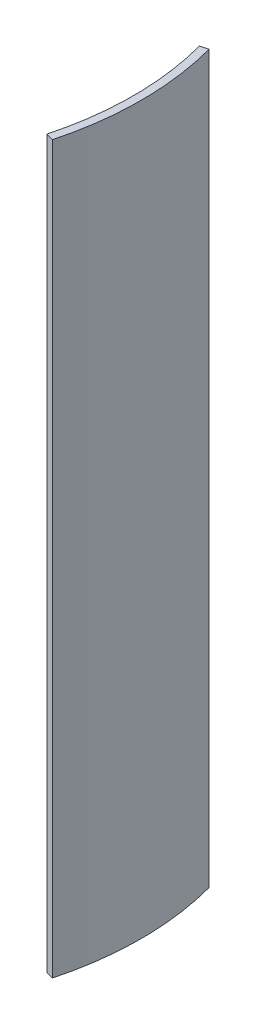
ISO-10303-21;
HEADER;
FILE_DESCRIPTION(('STEP AP214'),'2;1');
FILE_NAME('part.step','',(''),(''),'','','');
FILE_SCHEMA(('AUTOMOTIVE_DESIGN { 1 0 10303 214 1 1 1 1 }'));
ENDSEC;
DATA;
#1=APPLICATION_CONTEXT('core data for automotive mechanical design processes');
#2=APPLICATION_PROTOCOL_DEFINITION('international standard','automotive_design',2000,#1);
#3=PRODUCT_CONTEXT('',#1,'mechanical');
#4=PRODUCT('Part','Part','',(#3));
#5=PRODUCT_RELATED_PRODUCT_CATEGORY('part','',(#4));
#6=PRODUCT_DEFINITION_FORMATION('','',#4);
#7=PRODUCT_DEFINITION_CONTEXT('part definition',#1,'design');
#8=PRODUCT_DEFINITION('design','',#6,#7);
#9=PRODUCT_DEFINITION_SHAPE('','',#8);
#10=(LENGTH_UNIT() NAMED_UNIT(*) SI_UNIT(.MILLI.,.METRE.));
#11=(NAMED_UNIT(*) PLANE_ANGLE_UNIT() SI_UNIT($,.RADIAN.));
#12=(NAMED_UNIT(*) SI_UNIT($,.STERADIAN.) SOLID_ANGLE_UNIT());
#13=UNCERTAINTY_MEASURE_WITH_UNIT(LENGTH_MEASURE(1.E-05),#10,'distance_accuracy_value','');
#14=(GEOMETRIC_REPRESENTATION_CONTEXT(3) GLOBAL_UNCERTAINTY_ASSIGNED_CONTEXT((#13)) GLOBAL_UNIT_ASSIGNED_CONTEXT((#10,
#11,#12)) REPRESENTATION_CONTEXT('',''));
#15=CARTESIAN_POINT('',(0.,0.,0.));
#16=DIRECTION('',(0.,0.,1.));
#17=DIRECTION('',(1.,0.,0.));
#18=AXIS2_PLACEMENT_3D('',#15,#16,#17);
#19=CARTESIAN_POINT('',(0.,1800.,0.));
#20=DIRECTION('',(0.,-1.,0.));
#21=DIRECTION('',(0.,0.,-1.));
#22=AXIS2_PLACEMENT_3D('',#19,#20,#21);
#23=CYLINDRICAL_SURFACE('',#22,730.5);
#24=CARTESIAN_POINT('',(0.,0.,0.));
#25=DIRECTION('',(0.,-1.,0.));
#26=DIRECTION('',(0.,0.,1.));
#27=AXIS2_PLACEMENT_3D('',#24,#25,#26);
#28=CIRCLE('',#27,730.5);
#29=CARTESIAN_POINT('',(705.608816104164,0.,-189.067312447392));
#30=VERTEX_POINT('',#29);
#31=CARTESIAN_POINT('',(705.608816104164,0.,189.067312447392));
#32=VERTEX_POINT('',#31);
#33=EDGE_CURVE('E107',#30,#32,#28,.T.);
#34=ORIENTED_EDGE('',*,*,#33,.T.);
#35=DIRECTION('',(0.,-1.,0.));
#36=VECTOR('',#35,1.);
#37=CARTESIAN_POINT('',(705.608816104164,1800.,189.067312447392));
#38=LINE('',#37,#36);
#39=CARTESIAN_POINT('',(705.608816104164,1800.,189.067312447392));
#40=VERTEX_POINT('',#39);
#41=EDGE_CURVE('E11',#40,#32,#38,.T.);
#42=ORIENTED_EDGE('',*,*,#41,.F.);
#43=CARTESIAN_POINT('',(0.,1800.,0.));
#44=DIRECTION('',(0.,-1.,0.));
#45=DIRECTION('',(0.,0.,1.));
#46=AXIS2_PLACEMENT_3D('',#43,#44,#45);
#47=CIRCLE('',#46,730.5);
#48=CARTESIAN_POINT('',(705.608816104164,1800.,-189.067312447392));
#49=VERTEX_POINT('',#48);
#50=EDGE_CURVE('E91',#49,#40,#47,.T.);
#51=ORIENTED_EDGE('',*,*,#50,.F.);
#52=DIRECTION('',(0.,-1.,0.));
#53=VECTOR('',#52,1.);
#54=CARTESIAN_POINT('',(705.608816104164,1800.,-189.067312447392));
#55=LINE('',#54,#53);
#56=EDGE_CURVE('E103',#49,#30,#55,.T.);
#57=ORIENTED_EDGE('',*,*,#56,.T.);
#58=EDGE_LOOP('',(#34,#42,#51,#57));
#59=FACE_BOUND('',#58,.T.);
#60=ADVANCED_FACE('F39',(#59),#23,.F.);
#61=CARTESIAN_POINT('',(705.608816104164,1800.,189.067312447392));
#62=DIRECTION('',(0.25881904510252,0.,-0.965925826289069));
#63=DIRECTION('',(-0.965925826289068,0.,-0.25881904510252));
#64=AXIS2_PLACEMENT_3D('',#61,#62,#63);
#65=PLANE('',#64);
#66=DIRECTION('',(0.965925826289068,0.,0.25881904510252));
#67=VECTOR('',#66,1.);
#68=CARTESIAN_POINT('',(705.608816104164,0.,189.067312447392));
#69=LINE('',#68,#67);
#70=CARTESIAN_POINT('',(724.444369716801,0.,194.114283826891));
#71=VERTEX_POINT('',#70);
#72=EDGE_CURVE('E96',#32,#71,#69,.T.);
#73=ORIENTED_EDGE('',*,*,#72,.T.);
#74=DIRECTION('',(0.,-1.,0.));
#75=VECTOR('',#74,1.);
#76=CARTESIAN_POINT('',(724.444369716801,1800.,194.114283826891));
#77=LINE('',#76,#75);
#78=CARTESIAN_POINT('',(724.444369716801,1800.,194.114283826891));
#79=VERTEX_POINT('',#78);
#80=EDGE_CURVE('E48',#79,#71,#77,.T.);
#81=ORIENTED_EDGE('',*,*,#80,.F.);
#82=DIRECTION('',(0.965925826289068,0.,0.25881904510252));
#83=VECTOR('',#82,1.);
#84=CARTESIAN_POINT('',(705.608816104164,1800.,189.067312447392));
#85=LINE('',#84,#83);
#86=EDGE_CURVE('E86',#40,#79,#85,.T.);
#87=ORIENTED_EDGE('',*,*,#86,.F.);
#88=ORIENTED_EDGE('',*,*,#41,.T.);
#89=EDGE_LOOP('',(#73,#81,#87,#88));
#90=FACE_BOUND('',#89,.T.);
#91=ADVANCED_FACE('F95',(#90),#65,.F.);
#92=CARTESIAN_POINT('',(0.,1800.,0.));
#93=DIRECTION('',(0.,-1.,0.));
#94=DIRECTION('',(0.,0.,-1.));
#95=AXIS2_PLACEMENT_3D('',#92,#93,#94);
#96=CYLINDRICAL_SURFACE('',#95,750.);
#97=CARTESIAN_POINT('',(0.,0.,0.));
#98=DIRECTION('',(0.,1.,0.));
#99=DIRECTION('',(0.,0.,1.));
#100=AXIS2_PLACEMENT_3D('',#97,#98,#99);
#101=CIRCLE('',#100,750.);
#102=CARTESIAN_POINT('',(724.444369716801,0.,-194.114283826891));
#103=VERTEX_POINT('',#102);
#104=EDGE_CURVE('E73',#71,#103,#101,.T.);
#105=ORIENTED_EDGE('',*,*,#104,.T.);
#106=DIRECTION('',(0.,-1.,0.));
#107=VECTOR('',#106,1.);
#108=CARTESIAN_POINT('',(724.444369716801,1800.,-194.114283826891));
#109=LINE('',#108,#107);
#110=CARTESIAN_POINT('',(724.444369716801,1800.,-194.114283826891));
#111=VERTEX_POINT('',#110);
#112=EDGE_CURVE('E98',#111,#103,#109,.T.);
#113=ORIENTED_EDGE('',*,*,#112,.F.);
#114=CARTESIAN_POINT('',(0.,1800.,0.));
#115=DIRECTION('',(0.,1.,0.));
#116=DIRECTION('',(0.,0.,1.));
#117=AXIS2_PLACEMENT_3D('',#114,#115,#116);
#118=CIRCLE('',#117,750.);
#119=EDGE_CURVE('E89',#79,#111,#118,.T.);
#120=ORIENTED_EDGE('',*,*,#119,.F.);
#121=ORIENTED_EDGE('',*,*,#80,.T.);
#122=EDGE_LOOP('',(#105,#113,#120,#121));
#123=FACE_BOUND('',#122,.T.);
#124=ADVANCED_FACE('F99',(#123),#96,.T.);
#125=CARTESIAN_POINT('',(705.608816104164,1800.,-189.067312447392));
#126=DIRECTION('',(0.25881904510252,0.,0.965925826289069));
#127=DIRECTION('',(0.965925826289068,0.,-0.25881904510252));
#128=AXIS2_PLACEMENT_3D('',#125,#126,#127);
#129=PLANE('',#128);
#130=DIRECTION('',(-0.965925826289068,0.,0.25881904510252));
#131=VECTOR('',#130,1.);
#132=CARTESIAN_POINT('',(705.608816104164,0.,-189.067312447392));
#133=LINE('',#132,#131);
#134=EDGE_CURVE('E79',#103,#30,#133,.T.);
#135=ORIENTED_EDGE('',*,*,#134,.T.);
#136=ORIENTED_EDGE('',*,*,#56,.F.);
#137=DIRECTION('',(-0.965925826289068,0.,0.25881904510252));
#138=VECTOR('',#137,1.);
#139=CARTESIAN_POINT('',(705.608816104164,1800.,-189.067312447392));
#140=LINE('',#139,#138);
#141=EDGE_CURVE('E56',#111,#49,#140,.T.);
#142=ORIENTED_EDGE('',*,*,#141,.F.);
#143=ORIENTED_EDGE('',*,*,#112,.T.);
#144=EDGE_LOOP('',(#135,#136,#142,#143));
#145=FACE_BOUND('',#144,.T.);
#146=ADVANCED_FACE('F120',(#145),#129,.F.);
#147=CARTESIAN_POINT('',(0.,1800.,0.));
#148=DIRECTION('',(0.,1.,0.));
#149=DIRECTION('',(0.,0.,1.));
#150=AXIS2_PLACEMENT_3D('',#147,#148,#149);
#151=PLANE('',#150);
#152=ORIENTED_EDGE('',*,*,#50,.T.);
#153=ORIENTED_EDGE('',*,*,#86,.T.);
#154=ORIENTED_EDGE('',*,*,#119,.T.);
#155=ORIENTED_EDGE('',*,*,#141,.T.);
#156=EDGE_LOOP('',(#152,#153,#154,#155));
#157=FACE_BOUND('',#156,.T.);
#158=ADVANCED_FACE('F87',(#157),#151,.T.);
#159=CARTESIAN_POINT('',(0.,0.,0.));
#160=DIRECTION('',(0.,1.,0.));
#161=DIRECTION('',(0.,0.,1.));
#162=AXIS2_PLACEMENT_3D('',#159,#160,#161);
#163=PLANE('',#162);
#164=ORIENTED_EDGE('',*,*,#33,.F.);
#165=ORIENTED_EDGE('',*,*,#134,.F.);
#166=ORIENTED_EDGE('',*,*,#104,.F.);
#167=ORIENTED_EDGE('',*,*,#72,.F.);
#168=EDGE_LOOP('',(#164,#165,#166,#167));
#169=FACE_BOUND('',#168,.T.);
#170=ADVANCED_FACE('F123',(#169),#163,.F.);
#171=CLOSED_SHELL('',(#60,#91,#124,#146,#158,#170));
#172=MANIFOLD_SOLID_BREP('B2',#171);
#173=ADVANCED_BREP_SHAPE_REPRESENTATION('',(#18,#172),#14);
#174=SHAPE_DEFINITION_REPRESENTATION(#9,#173);
ENDSEC;
END-ISO-10303-21;
